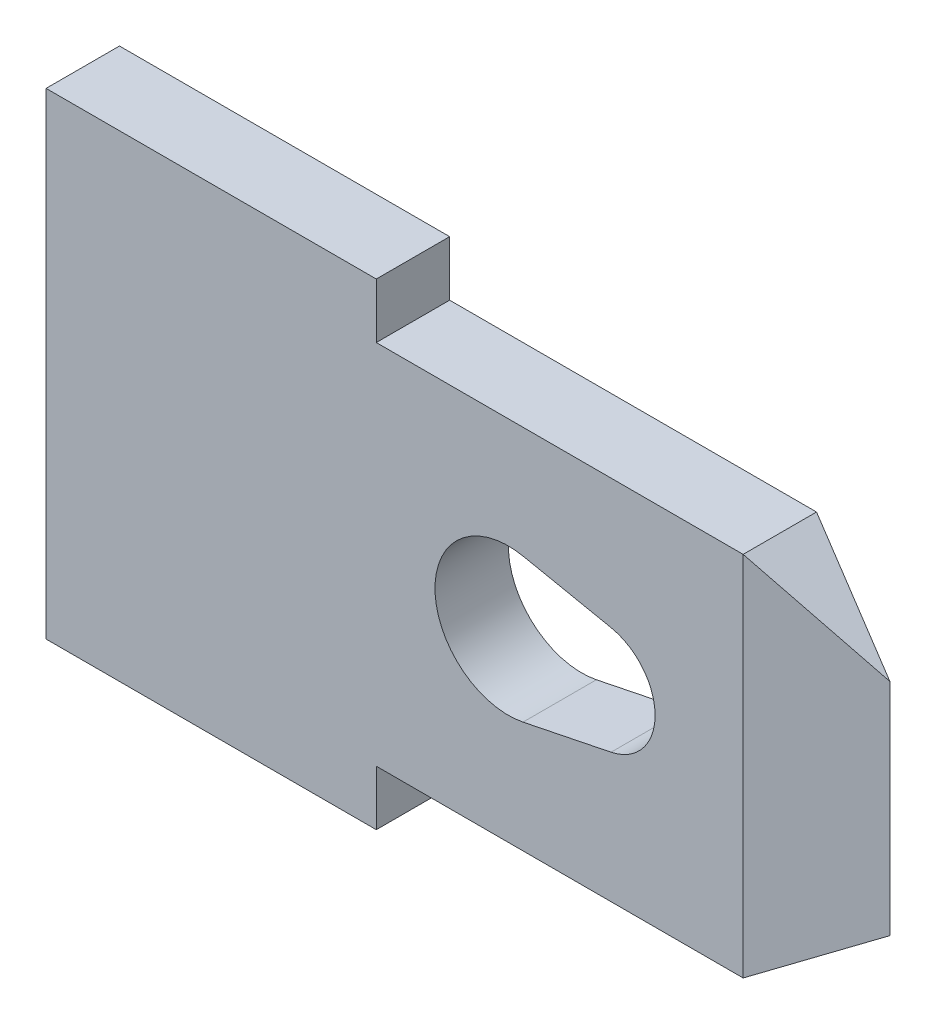
ISO-10303-21;
HEADER;
FILE_DESCRIPTION(('STEP AP214'),'2;1');
FILE_NAME('part.step','',(''),(''),'','','');
FILE_SCHEMA(('AUTOMOTIVE_DESIGN { 1 0 10303 214 1 1 1 1 }'));
ENDSEC;
DATA;
#1=APPLICATION_CONTEXT('core data for automotive mechanical design processes');
#2=APPLICATION_PROTOCOL_DEFINITION('international standard','automotive_design',2000,#1);
#3=PRODUCT_CONTEXT('',#1,'mechanical');
#4=PRODUCT('Part','Part','',(#3));
#5=PRODUCT_RELATED_PRODUCT_CATEGORY('part','',(#4));
#6=PRODUCT_DEFINITION_FORMATION('','',#4);
#7=PRODUCT_DEFINITION_CONTEXT('part definition',#1,'design');
#8=PRODUCT_DEFINITION('design','',#6,#7);
#9=PRODUCT_DEFINITION_SHAPE('','',#8);
#10=(LENGTH_UNIT() NAMED_UNIT(*) SI_UNIT(.MILLI.,.METRE.));
#11=(NAMED_UNIT(*) PLANE_ANGLE_UNIT() SI_UNIT($,.RADIAN.));
#12=(NAMED_UNIT(*) SI_UNIT($,.STERADIAN.) SOLID_ANGLE_UNIT());
#13=UNCERTAINTY_MEASURE_WITH_UNIT(LENGTH_MEASURE(1.E-05),#10,'distance_accuracy_value','');
#14=(GEOMETRIC_REPRESENTATION_CONTEXT(3) GLOBAL_UNCERTAINTY_ASSIGNED_CONTEXT((#13)) GLOBAL_UNIT_ASSIGNED_CONTEXT((#10,
#11,#12)) REPRESENTATION_CONTEXT('',''));
#15=CARTESIAN_POINT('',(0.,0.,0.));
#16=DIRECTION('',(0.,0.,1.));
#17=DIRECTION('',(1.,0.,0.));
#18=AXIS2_PLACEMENT_3D('',#15,#16,#17);
#19=CARTESIAN_POINT('',(9.5,-2.5,1.));
#20=DIRECTION('',(-0.554700196225229,0.832050294337844,0.));
#21=DIRECTION('',(-0.832050294337844,-0.554700196225229,0.));
#22=AXIS2_PLACEMENT_3D('',#19,#20,#21);
#23=PLANE('',#22);
#24=DIRECTION('',(0.801783725737273,0.534522483824849,0.267261241912424));
#25=VECTOR('',#24,1.);
#26=CARTESIAN_POINT('',(3.071,-6.786,-2.143));
#27=LINE('',#26,#25);
#28=CARTESIAN_POINT('',(9.5,-2.5,0.));
#29=VERTEX_POINT('',#28);
#30=CARTESIAN_POINT('',(11.,-1.5,0.499999999999999));
#31=VERTEX_POINT('',#30);
#32=EDGE_CURVE('E135',#29,#31,#27,.T.);
#33=ORIENTED_EDGE('',*,*,#32,.T.);
#34=DIRECTION('',(-0.801783725737273,-0.534522483824849,0.267261241912424));
#35=VECTOR('',#34,1.);
#36=CARTESIAN_POINT('',(3.28528571428572,-6.64314285714286,3.07157142857143));
#37=LINE('',#36,#35);
#38=CARTESIAN_POINT('',(9.5,-2.5,1.));
#39=VERTEX_POINT('',#38);
#40=EDGE_CURVE('E224',#31,#39,#37,.T.);
#41=ORIENTED_EDGE('',*,*,#40,.T.);
#42=DIRECTION('',(0.,0.,-1.));
#43=VECTOR('',#42,1.);
#44=CARTESIAN_POINT('',(9.5,-2.5,1.));
#45=LINE('',#44,#43);
#46=EDGE_CURVE('E178',#39,#29,#45,.T.);
#47=ORIENTED_EDGE('',*,*,#46,.T.);
#48=EDGE_LOOP('',(#33,#41,#47));
#49=FACE_BOUND('',#48,.T.);
#50=ADVANCED_FACE('F35',(#49),#23,.F.);
#51=CARTESIAN_POINT('',(9.5,2.5,1.));
#52=DIRECTION('',(-0.554700196225229,-0.832050294337844,0.));
#53=DIRECTION('',(0.832050294337844,-0.554700196225229,0.));
#54=AXIS2_PLACEMENT_3D('',#51,#52,#53);
#55=PLANE('',#54);
#56=DIRECTION('',(-0.801783725737273,0.534522483824849,-0.267261241912424));
#57=VECTOR('',#56,1.);
#58=CARTESIAN_POINT('',(5.85757142857143,4.92828571428571,-1.21414285714286));
#59=LINE('',#58,#57);
#60=CARTESIAN_POINT('',(11.,1.5,0.5));
#61=VERTEX_POINT('',#60);
#62=CARTESIAN_POINT('',(9.5,2.5,0.));
#63=VERTEX_POINT('',#62);
#64=EDGE_CURVE('E132',#61,#63,#59,.T.);
#65=ORIENTED_EDGE('',*,*,#64,.T.);
#66=DIRECTION('',(0.,0.,-1.));
#67=VECTOR('',#66,1.);
#68=CARTESIAN_POINT('',(9.5,2.5,1.));
#69=LINE('',#68,#67);
#70=CARTESIAN_POINT('',(9.5,2.5,1.));
#71=VERTEX_POINT('',#70);
#72=EDGE_CURVE('E12',#71,#63,#69,.T.);
#73=ORIENTED_EDGE('',*,*,#72,.F.);
#74=DIRECTION('',(0.801783725737273,-0.534522483824849,-0.267261241912424));
#75=VECTOR('',#74,1.);
#76=CARTESIAN_POINT('',(6.07185714285714,4.78542857142857,2.14271428571429));
#77=LINE('',#76,#75);
#78=EDGE_CURVE('E140',#71,#61,#77,.T.);
#79=ORIENTED_EDGE('',*,*,#78,.T.);
#80=EDGE_LOOP('',(#65,#73,#79));
#81=FACE_BOUND('',#80,.T.);
#82=ADVANCED_FACE('F145',(#81),#55,.F.);
#83=CARTESIAN_POINT('',(0.,0.,0.));
#84=DIRECTION('',(0.,0.,-1.));
#85=DIRECTION('',(-1.,0.,0.));
#86=AXIS2_PLACEMENT_3D('',#83,#84,#85);
#87=PLANE('',#86);
#88=CARTESIAN_POINT('',(6.3,0.,0.));
#89=DIRECTION('',(0.,0.,-1.));
#90=DIRECTION('',(-1.,0.,0.));
#91=AXIS2_PLACEMENT_3D('',#88,#89,#90);
#92=CIRCLE('',#91,1.);
#93=CARTESIAN_POINT('',(6.5,0.979795897113271,0.));
#94=VERTEX_POINT('',#93);
#95=CARTESIAN_POINT('',(6.5,-0.979795897113272,0.));
#96=VERTEX_POINT('',#95);
#97=EDGE_CURVE('E238',#94,#96,#92,.F.);
#98=ORIENTED_EDGE('',*,*,#97,.T.);
#99=DIRECTION('',(0.979795897113271,0.2,0.));
#100=VECTOR('',#99,1.);
#101=CARTESIAN_POINT('',(6.5,-0.979795897113272,0.));
#102=LINE('',#101,#100);
#103=CARTESIAN_POINT('',(7.7,-0.734846922834954,0.));
#104=VERTEX_POINT('',#103);
#105=EDGE_CURVE('E158',#96,#104,#102,.T.);
#106=ORIENTED_EDGE('',*,*,#105,.T.);
#107=CARTESIAN_POINT('',(7.55,0.,0.));
#108=DIRECTION('',(0.,0.,-1.));
#109=DIRECTION('',(-1.,0.,0.));
#110=AXIS2_PLACEMENT_3D('',#107,#108,#109);
#111=CIRCLE('',#110,0.75);
#112=CARTESIAN_POINT('',(7.7,0.734846922834953,0.));
#113=VERTEX_POINT('',#112);
#114=EDGE_CURVE('E231',#104,#113,#111,.F.);
#115=ORIENTED_EDGE('',*,*,#114,.T.);
#116=DIRECTION('',(-0.979795897113271,0.2,0.));
#117=VECTOR('',#116,1.);
#118=CARTESIAN_POINT('',(6.5,0.979795897113271,0.));
#119=LINE('',#118,#117);
#120=EDGE_CURVE('E235',#113,#94,#119,.T.);
#121=ORIENTED_EDGE('',*,*,#120,.T.);
#122=EDGE_LOOP('',(#98,#106,#115,#121));
#123=FACE_BOUND('',#122,.T.);
#124=DIRECTION('',(-1.,0.,0.));
#125=VECTOR('',#124,1.);
#126=CARTESIAN_POINT('',(4.5,2.5,0.));
#127=LINE('',#126,#125);
#128=CARTESIAN_POINT('',(4.5,2.5,0.));
#129=VERTEX_POINT('',#128);
#130=EDGE_CURVE('E151',#63,#129,#127,.T.);
#131=ORIENTED_EDGE('',*,*,#130,.F.);
#132=DIRECTION('',(0.,1.,0.));
#133=VECTOR('',#132,1.);
#134=CARTESIAN_POINT('',(9.5,-3.251,0.));
#135=LINE('',#134,#133);
#136=EDGE_CURVE('E129',#29,#63,#135,.T.);
#137=ORIENTED_EDGE('',*,*,#136,.F.);
#138=DIRECTION('',(1.,0.,0.));
#139=VECTOR('',#138,1.);
#140=CARTESIAN_POINT('',(4.5,-2.5,0.));
#141=LINE('',#140,#139);
#142=CARTESIAN_POINT('',(4.5,-2.5,0.));
#143=VERTEX_POINT('',#142);
#144=EDGE_CURVE('E176',#143,#29,#141,.T.);
#145=ORIENTED_EDGE('',*,*,#144,.F.);
#146=DIRECTION('',(0.,1.,0.));
#147=VECTOR('',#146,1.);
#148=CARTESIAN_POINT('',(4.5,-3.25,0.));
#149=LINE('',#148,#147);
#150=CARTESIAN_POINT('',(4.5,-3.25,0.));
#151=VERTEX_POINT('',#150);
#152=EDGE_CURVE('E174',#151,#143,#149,.T.);
#153=ORIENTED_EDGE('',*,*,#152,.F.);
#154=DIRECTION('',(1.,0.,0.));
#155=VECTOR('',#154,1.);
#156=CARTESIAN_POINT('',(0.,-3.25,0.));
#157=LINE('',#156,#155);
#158=CARTESIAN_POINT('',(0.,-3.25,0.));
#159=VERTEX_POINT('',#158);
#160=EDGE_CURVE('E172',#159,#151,#157,.T.);
#161=ORIENTED_EDGE('',*,*,#160,.F.);
#162=DIRECTION('',(0.,-1.,0.));
#163=VECTOR('',#162,1.);
#164=CARTESIAN_POINT('',(0.,-3.25,0.));
#165=LINE('',#164,#163);
#166=CARTESIAN_POINT('',(0.,3.25,0.));
#167=VERTEX_POINT('',#166);
#168=EDGE_CURVE('E170',#167,#159,#165,.T.);
#169=ORIENTED_EDGE('',*,*,#168,.F.);
#170=DIRECTION('',(-1.,0.,0.));
#171=VECTOR('',#170,1.);
#172=CARTESIAN_POINT('',(0.,3.25,0.));
#173=LINE('',#172,#171);
#174=CARTESIAN_POINT('',(4.5,3.25,0.));
#175=VERTEX_POINT('',#174);
#176=EDGE_CURVE('E160',#175,#167,#173,.T.);
#177=ORIENTED_EDGE('',*,*,#176,.F.);
#178=DIRECTION('',(0.,1.,0.));
#179=VECTOR('',#178,1.);
#180=CARTESIAN_POINT('',(4.5,3.25,0.));
#181=LINE('',#180,#179);
#182=EDGE_CURVE('E157',#129,#175,#181,.T.);
#183=ORIENTED_EDGE('',*,*,#182,.F.);
#184=EDGE_LOOP('',(#131,#137,#145,#153,#161,#169,#177,#183));
#185=FACE_BOUND('',#184,.T.);
#186=ADVANCED_FACE('F155',(#123,#185),#87,.T.);
#187=CARTESIAN_POINT('',(0.,0.,1.));
#188=DIRECTION('',(0.,0.,-1.));
#189=DIRECTION('',(-1.,0.,0.));
#190=AXIS2_PLACEMENT_3D('',#187,#188,#189);
#191=PLANE('',#190);
#192=DIRECTION('',(0.979795897113271,0.2,0.));
#193=VECTOR('',#192,1.);
#194=CARTESIAN_POINT('',(6.5,-0.979795897113272,1.));
#195=LINE('',#194,#193);
#196=CARTESIAN_POINT('',(6.5,-0.979795897113271,1.));
#197=VERTEX_POINT('',#196);
#198=CARTESIAN_POINT('',(7.7,-0.734846922834954,1.));
#199=VERTEX_POINT('',#198);
#200=EDGE_CURVE('E242',#197,#199,#195,.T.);
#201=ORIENTED_EDGE('',*,*,#200,.F.);
#202=CARTESIAN_POINT('',(6.3,0.,1.));
#203=DIRECTION('',(0.,0.,1.));
#204=DIRECTION('',(1.,0.,0.));
#205=AXIS2_PLACEMENT_3D('',#202,#203,#204);
#206=CIRCLE('',#205,1.);
#207=CARTESIAN_POINT('',(6.5,0.979795897113271,1.));
#208=VERTEX_POINT('',#207);
#209=EDGE_CURVE('E49',#208,#197,#206,.T.);
#210=ORIENTED_EDGE('',*,*,#209,.F.);
#211=DIRECTION('',(-0.979795897113271,0.2,0.));
#212=VECTOR('',#211,1.);
#213=CARTESIAN_POINT('',(6.5,0.979795897113271,1.));
#214=LINE('',#213,#212);
#215=CARTESIAN_POINT('',(7.7,0.734846922834953,1.));
#216=VERTEX_POINT('',#215);
#217=EDGE_CURVE('E247',#216,#208,#214,.T.);
#218=ORIENTED_EDGE('',*,*,#217,.F.);
#219=CARTESIAN_POINT('',(7.55,0.,1.));
#220=DIRECTION('',(0.,0.,1.));
#221=DIRECTION('',(1.,0.,0.));
#222=AXIS2_PLACEMENT_3D('',#219,#220,#221);
#223=CIRCLE('',#222,0.75);
#224=EDGE_CURVE('E244',#199,#216,#223,.T.);
#225=ORIENTED_EDGE('',*,*,#224,.F.);
#226=EDGE_LOOP('',(#201,#210,#218,#225));
#227=FACE_BOUND('',#226,.T.);
#228=DIRECTION('',(0.,1.,0.));
#229=VECTOR('',#228,1.);
#230=CARTESIAN_POINT('',(9.5,-3.251,1.));
#231=LINE('',#230,#229);
#232=EDGE_CURVE('E218',#39,#71,#231,.T.);
#233=ORIENTED_EDGE('',*,*,#232,.T.);
#234=DIRECTION('',(-1.,0.,0.));
#235=VECTOR('',#234,1.);
#236=CARTESIAN_POINT('',(4.5,2.5,1.));
#237=LINE('',#236,#235);
#238=CARTESIAN_POINT('',(4.5,2.5,1.));
#239=VERTEX_POINT('',#238);
#240=EDGE_CURVE('E153',#71,#239,#237,.T.);
#241=ORIENTED_EDGE('',*,*,#240,.T.);
#242=DIRECTION('',(0.,1.,0.));
#243=VECTOR('',#242,1.);
#244=CARTESIAN_POINT('',(4.5,3.25,1.));
#245=LINE('',#244,#243);
#246=CARTESIAN_POINT('',(4.5,3.25,1.));
#247=VERTEX_POINT('',#246);
#248=EDGE_CURVE('E199',#239,#247,#245,.T.);
#249=ORIENTED_EDGE('',*,*,#248,.T.);
#250=DIRECTION('',(-1.,0.,0.));
#251=VECTOR('',#250,1.);
#252=CARTESIAN_POINT('',(0.,3.25,1.));
#253=LINE('',#252,#251);
#254=CARTESIAN_POINT('',(0.,3.25,1.));
#255=VERTEX_POINT('',#254);
#256=EDGE_CURVE('E202',#247,#255,#253,.T.);
#257=ORIENTED_EDGE('',*,*,#256,.T.);
#258=DIRECTION('',(0.,-1.,0.));
#259=VECTOR('',#258,1.);
#260=CARTESIAN_POINT('',(0.,-3.25,1.));
#261=LINE('',#260,#259);
#262=CARTESIAN_POINT('',(0.,-3.25,1.));
#263=VERTEX_POINT('',#262);
#264=EDGE_CURVE('E204',#255,#263,#261,.T.);
#265=ORIENTED_EDGE('',*,*,#264,.T.);
#266=DIRECTION('',(1.,0.,0.));
#267=VECTOR('',#266,1.);
#268=CARTESIAN_POINT('',(0.,-3.25,1.));
#269=LINE('',#268,#267);
#270=CARTESIAN_POINT('',(4.5,-3.25,1.));
#271=VERTEX_POINT('',#270);
#272=EDGE_CURVE('E209',#263,#271,#269,.T.);
#273=ORIENTED_EDGE('',*,*,#272,.T.);
#274=DIRECTION('',(0.,1.,0.));
#275=VECTOR('',#274,1.);
#276=CARTESIAN_POINT('',(4.5,-3.25,1.));
#277=LINE('',#276,#275);
#278=CARTESIAN_POINT('',(4.5,-2.5,1.));
#279=VERTEX_POINT('',#278);
#280=EDGE_CURVE('E210',#271,#279,#277,.T.);
#281=ORIENTED_EDGE('',*,*,#280,.T.);
#282=DIRECTION('',(1.,0.,0.));
#283=VECTOR('',#282,1.);
#284=CARTESIAN_POINT('',(4.5,-2.5,1.));
#285=LINE('',#284,#283);
#286=EDGE_CURVE('E166',#279,#39,#285,.T.);
#287=ORIENTED_EDGE('',*,*,#286,.T.);
#288=EDGE_LOOP('',(#233,#241,#249,#257,#265,#273,#281,#287));
#289=FACE_BOUND('',#288,.T.);
#290=ADVANCED_FACE('F217',(#227,#289),#191,.F.);
#291=CARTESIAN_POINT('',(4.5,2.5,1.));
#292=DIRECTION('',(0.,-1.,0.));
#293=DIRECTION('',(0.,0.,-1.));
#294=AXIS2_PLACEMENT_3D('',#291,#292,#293);
#295=PLANE('',#294);
#296=ORIENTED_EDGE('',*,*,#130,.T.);
#297=DIRECTION('',(0.,0.,-1.));
#298=VECTOR('',#297,1.);
#299=CARTESIAN_POINT('',(4.5,2.5,1.));
#300=LINE('',#299,#298);
#301=EDGE_CURVE('E42',#239,#129,#300,.T.);
#302=ORIENTED_EDGE('',*,*,#301,.F.);
#303=ORIENTED_EDGE('',*,*,#240,.F.);
#304=ORIENTED_EDGE('',*,*,#72,.T.);
#305=EDGE_LOOP('',(#296,#302,#303,#304));
#306=FACE_BOUND('',#305,.T.);
#307=ADVANCED_FACE('F149',(#306),#295,.F.);
#308=CARTESIAN_POINT('',(4.5,3.25,1.));
#309=DIRECTION('',(-1.,0.,0.));
#310=DIRECTION('',(0.,0.,1.));
#311=AXIS2_PLACEMENT_3D('',#308,#309,#310);
#312=PLANE('',#311);
#313=ORIENTED_EDGE('',*,*,#182,.T.);
#314=DIRECTION('',(0.,0.,-1.));
#315=VECTOR('',#314,1.);
#316=CARTESIAN_POINT('',(4.5,3.25,1.));
#317=LINE('',#316,#315);
#318=EDGE_CURVE('E193',#247,#175,#317,.T.);
#319=ORIENTED_EDGE('',*,*,#318,.F.);
#320=ORIENTED_EDGE('',*,*,#248,.F.);
#321=ORIENTED_EDGE('',*,*,#301,.T.);
#322=EDGE_LOOP('',(#313,#319,#320,#321));
#323=FACE_BOUND('',#322,.T.);
#324=ADVANCED_FACE('F197',(#323),#312,.F.);
#325=CARTESIAN_POINT('',(0.,3.25,1.));
#326=DIRECTION('',(0.,-1.,0.));
#327=DIRECTION('',(0.,0.,-1.));
#328=AXIS2_PLACEMENT_3D('',#325,#326,#327);
#329=PLANE('',#328);
#330=ORIENTED_EDGE('',*,*,#176,.T.);
#331=DIRECTION('',(0.,0.,-1.));
#332=VECTOR('',#331,1.);
#333=CARTESIAN_POINT('',(0.,3.25,1.));
#334=LINE('',#333,#332);
#335=EDGE_CURVE('E190',#255,#167,#334,.T.);
#336=ORIENTED_EDGE('',*,*,#335,.F.);
#337=ORIENTED_EDGE('',*,*,#256,.F.);
#338=ORIENTED_EDGE('',*,*,#318,.T.);
#339=EDGE_LOOP('',(#330,#336,#337,#338));
#340=FACE_BOUND('',#339,.T.);
#341=ADVANCED_FACE('F290',(#340),#329,.F.);
#342=CARTESIAN_POINT('',(0.,-3.25,1.));
#343=DIRECTION('',(1.,0.,0.));
#344=DIRECTION('',(0.,0.,-1.));
#345=AXIS2_PLACEMENT_3D('',#342,#343,#344);
#346=PLANE('',#345);
#347=ORIENTED_EDGE('',*,*,#168,.T.);
#348=DIRECTION('',(0.,0.,-1.));
#349=VECTOR('',#348,1.);
#350=CARTESIAN_POINT('',(0.,-3.25,1.));
#351=LINE('',#350,#349);
#352=EDGE_CURVE('E187',#263,#159,#351,.T.);
#353=ORIENTED_EDGE('',*,*,#352,.F.);
#354=ORIENTED_EDGE('',*,*,#264,.F.);
#355=ORIENTED_EDGE('',*,*,#335,.T.);
#356=EDGE_LOOP('',(#347,#353,#354,#355));
#357=FACE_BOUND('',#356,.T.);
#358=ADVANCED_FACE('F293',(#357),#346,.F.);
#359=CARTESIAN_POINT('',(0.,-3.25,1.));
#360=DIRECTION('',(0.,1.,0.));
#361=DIRECTION('',(0.,0.,1.));
#362=AXIS2_PLACEMENT_3D('',#359,#360,#361);
#363=PLANE('',#362);
#364=ORIENTED_EDGE('',*,*,#160,.T.);
#365=DIRECTION('',(0.,0.,-1.));
#366=VECTOR('',#365,1.);
#367=CARTESIAN_POINT('',(4.5,-3.25,1.));
#368=LINE('',#367,#366);
#369=EDGE_CURVE('E184',#271,#151,#368,.T.);
#370=ORIENTED_EDGE('',*,*,#369,.F.);
#371=ORIENTED_EDGE('',*,*,#272,.F.);
#372=ORIENTED_EDGE('',*,*,#352,.T.);
#373=EDGE_LOOP('',(#364,#370,#371,#372));
#374=FACE_BOUND('',#373,.T.);
#375=ADVANCED_FACE('F297',(#374),#363,.F.);
#376=CARTESIAN_POINT('',(4.5,-3.25,1.));
#377=DIRECTION('',(-1.,0.,0.));
#378=DIRECTION('',(0.,0.,1.));
#379=AXIS2_PLACEMENT_3D('',#376,#377,#378);
#380=PLANE('',#379);
#381=ORIENTED_EDGE('',*,*,#152,.T.);
#382=DIRECTION('',(0.,0.,-1.));
#383=VECTOR('',#382,1.);
#384=CARTESIAN_POINT('',(4.5,-2.5,1.));
#385=LINE('',#384,#383);
#386=EDGE_CURVE('E181',#279,#143,#385,.T.);
#387=ORIENTED_EDGE('',*,*,#386,.F.);
#388=ORIENTED_EDGE('',*,*,#280,.F.);
#389=ORIENTED_EDGE('',*,*,#369,.T.);
#390=EDGE_LOOP('',(#381,#387,#388,#389));
#391=FACE_BOUND('',#390,.T.);
#392=ADVANCED_FACE('F301',(#391),#380,.F.);
#393=CARTESIAN_POINT('',(4.5,-2.5,1.));
#394=DIRECTION('',(0.,1.,0.));
#395=DIRECTION('',(0.,0.,1.));
#396=AXIS2_PLACEMENT_3D('',#393,#394,#395);
#397=PLANE('',#396);
#398=ORIENTED_EDGE('',*,*,#144,.T.);
#399=ORIENTED_EDGE('',*,*,#46,.F.);
#400=ORIENTED_EDGE('',*,*,#286,.F.);
#401=ORIENTED_EDGE('',*,*,#386,.T.);
#402=EDGE_LOOP('',(#398,#399,#400,#401));
#403=FACE_BOUND('',#402,.T.);
#404=ADVANCED_FACE('F220',(#403),#397,.F.);
#405=CARTESIAN_POINT('',(6.3,0.,-0.000999999999999916));
#406=DIRECTION('',(0.,0.,1.));
#407=DIRECTION('',(1.,0.,0.));
#408=AXIS2_PLACEMENT_3D('',#405,#406,#407);
#409=CYLINDRICAL_SURFACE('',#408,1.);
#410=DIRECTION('',(0.,0.,1.));
#411=VECTOR('',#410,1.);
#412=CARTESIAN_POINT('',(6.5,0.979795897113271,-0.000999999999999916));
#413=LINE('',#412,#411);
#414=EDGE_CURVE('E163',#94,#208,#413,.T.);
#415=ORIENTED_EDGE('',*,*,#414,.T.);
#416=ORIENTED_EDGE('',*,*,#209,.T.);
#417=DIRECTION('',(0.,0.,1.));
#418=VECTOR('',#417,1.);
#419=CARTESIAN_POINT('',(6.5,-0.979795897113272,-0.000999999999999916));
#420=LINE('',#419,#418);
#421=EDGE_CURVE('E250',#96,#197,#420,.T.);
#422=ORIENTED_EDGE('',*,*,#421,.F.);
#423=ORIENTED_EDGE('',*,*,#97,.F.);
#424=EDGE_LOOP('',(#415,#416,#422,#423));
#425=FACE_BOUND('',#424,.T.);
#426=ADVANCED_FACE('F265',(#425),#409,.F.);
#427=CARTESIAN_POINT('',(6.5,0.979795897113271,-0.000999999999999916));
#428=DIRECTION('',(0.2,0.979795897113271,0.));
#429=DIRECTION('',(-0.979795897113271,0.2,0.));
#430=AXIS2_PLACEMENT_3D('',#427,#428,#429);
#431=PLANE('',#430);
#432=DIRECTION('',(0.,0.,1.));
#433=VECTOR('',#432,1.);
#434=CARTESIAN_POINT('',(7.7,0.734846922834953,-0.000999999999999916));
#435=LINE('',#434,#433);
#436=EDGE_CURVE('E252',#113,#216,#435,.T.);
#437=ORIENTED_EDGE('',*,*,#436,.T.);
#438=ORIENTED_EDGE('',*,*,#217,.T.);
#439=ORIENTED_EDGE('',*,*,#414,.F.);
#440=ORIENTED_EDGE('',*,*,#120,.F.);
#441=EDGE_LOOP('',(#437,#438,#439,#440));
#442=FACE_BOUND('',#441,.T.);
#443=ADVANCED_FACE('F267',(#442),#431,.F.);
#444=CARTESIAN_POINT('',(7.55,0.,-0.000999999999999916));
#445=DIRECTION('',(0.,0.,1.));
#446=DIRECTION('',(1.,0.,0.));
#447=AXIS2_PLACEMENT_3D('',#444,#445,#446);
#448=CYLINDRICAL_SURFACE('',#447,0.75);
#449=DIRECTION('',(0.,0.,1.));
#450=VECTOR('',#449,1.);
#451=CARTESIAN_POINT('',(7.7,-0.734846922834954,-0.000999999999999916));
#452=LINE('',#451,#450);
#453=EDGE_CURVE('E57',#104,#199,#452,.T.);
#454=ORIENTED_EDGE('',*,*,#453,.T.);
#455=ORIENTED_EDGE('',*,*,#224,.T.);
#456=ORIENTED_EDGE('',*,*,#436,.F.);
#457=ORIENTED_EDGE('',*,*,#114,.F.);
#458=EDGE_LOOP('',(#454,#455,#456,#457));
#459=FACE_BOUND('',#458,.T.);
#460=ADVANCED_FACE('F262',(#459),#448,.F.);
#461=CARTESIAN_POINT('',(6.5,-0.979795897113272,-0.000999999999999916));
#462=DIRECTION('',(0.2,-0.979795897113271,0.));
#463=DIRECTION('',(0.979795897113271,0.2,0.));
#464=AXIS2_PLACEMENT_3D('',#461,#462,#463);
#465=PLANE('',#464);
#466=ORIENTED_EDGE('',*,*,#421,.T.);
#467=ORIENTED_EDGE('',*,*,#200,.T.);
#468=ORIENTED_EDGE('',*,*,#453,.F.);
#469=ORIENTED_EDGE('',*,*,#105,.F.);
#470=EDGE_LOOP('',(#466,#467,#468,#469));
#471=FACE_BOUND('',#470,.T.);
#472=ADVANCED_FACE('F256',(#471),#465,.F.);
#473=CARTESIAN_POINT('',(1.25,-3.251,3.75));
#474=DIRECTION('',(0.316227766016838,0.,0.948683298050514));
#475=DIRECTION('',(0.948683298050514,0.,-0.316227766016838));
#476=AXIS2_PLACEMENT_3D('',#473,#474,#475);
#477=PLANE('',#476);
#478=DIRECTION('',(0.,1.,0.));
#479=VECTOR('',#478,1.);
#480=CARTESIAN_POINT('',(11.,-3.251,0.5));
#481=LINE('',#480,#479);
#482=EDGE_CURVE('E226',#31,#61,#481,.T.);
#483=ORIENTED_EDGE('',*,*,#482,.T.);
#484=ORIENTED_EDGE('',*,*,#78,.F.);
#485=ORIENTED_EDGE('',*,*,#232,.F.);
#486=ORIENTED_EDGE('',*,*,#40,.F.);
#487=EDGE_LOOP('',(#483,#484,#485,#486));
#488=FACE_BOUND('',#487,.T.);
#489=ADVANCED_FACE('F311',(#488),#477,.T.);
#490=CARTESIAN_POINT('',(0.950000000000001,-3.251,-2.85));
#491=DIRECTION('',(0.316227766016838,0.,-0.948683298050514));
#492=DIRECTION('',(-0.948683298050514,0.,-0.316227766016838));
#493=AXIS2_PLACEMENT_3D('',#490,#491,#492);
#494=PLANE('',#493);
#495=ORIENTED_EDGE('',*,*,#136,.T.);
#496=ORIENTED_EDGE('',*,*,#64,.F.);
#497=ORIENTED_EDGE('',*,*,#482,.F.);
#498=ORIENTED_EDGE('',*,*,#32,.F.);
#499=EDGE_LOOP('',(#495,#496,#497,#498));
#500=FACE_BOUND('',#499,.T.);
#501=ADVANCED_FACE('F131',(#500),#494,.T.);
#502=CLOSED_SHELL('',(#50,#82,#186,#290,#307,#324,#341,#358,#375,#392,#404,#426,#443,#460,#472,
#489,#501));
#503=MANIFOLD_SOLID_BREP('B2',#502);
#504=ADVANCED_BREP_SHAPE_REPRESENTATION('',(#18,#503),#14);
#505=SHAPE_DEFINITION_REPRESENTATION(#9,#504);
ENDSEC;
END-ISO-10303-21;
